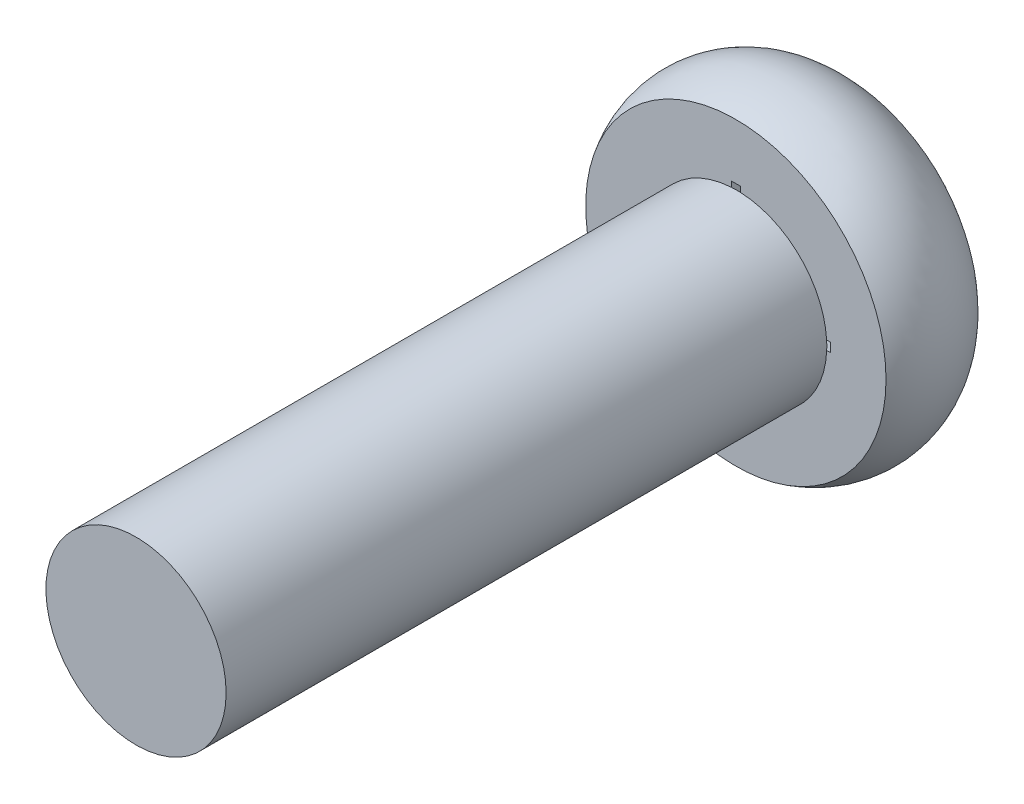
ISO-10303-21;
HEADER;
FILE_DESCRIPTION(('STEP AP214'),'2;1');
FILE_NAME('part.step','',(''),(''),'','','');
FILE_SCHEMA(('AUTOMOTIVE_DESIGN { 1 0 10303 214 1 1 1 1 }'));
ENDSEC;
DATA;
#1=APPLICATION_CONTEXT('core data for automotive mechanical design processes');
#2=APPLICATION_PROTOCOL_DEFINITION('international standard','automotive_design',2000,#1);
#3=PRODUCT_CONTEXT('',#1,'mechanical');
#4=PRODUCT('Part','Part','',(#3));
#5=PRODUCT_RELATED_PRODUCT_CATEGORY('part','',(#4));
#6=PRODUCT_DEFINITION_FORMATION('','',#4);
#7=PRODUCT_DEFINITION_CONTEXT('part definition',#1,'design');
#8=PRODUCT_DEFINITION('design','',#6,#7);
#9=PRODUCT_DEFINITION_SHAPE('','',#8);
#10=(LENGTH_UNIT() NAMED_UNIT(*) SI_UNIT(.MILLI.,.METRE.));
#11=(NAMED_UNIT(*) PLANE_ANGLE_UNIT() SI_UNIT($,.RADIAN.));
#12=(NAMED_UNIT(*) SI_UNIT($,.STERADIAN.) SOLID_ANGLE_UNIT());
#13=UNCERTAINTY_MEASURE_WITH_UNIT(LENGTH_MEASURE(1.E-05),#10,'distance_accuracy_value','');
#14=(GEOMETRIC_REPRESENTATION_CONTEXT(3) GLOBAL_UNCERTAINTY_ASSIGNED_CONTEXT((#13)) GLOBAL_UNIT_ASSIGNED_CONTEXT((#10,
#11,#12)) REPRESENTATION_CONTEXT('',''));
#15=CARTESIAN_POINT('',(0.,0.,0.));
#16=DIRECTION('',(0.,0.,1.));
#17=DIRECTION('',(1.,0.,0.));
#18=AXIS2_PLACEMENT_3D('',#15,#16,#17);
#19=CARTESIAN_POINT('',(0.,0.,-2.));
#20=DIRECTION('',(0.,0.,-1.));
#21=DIRECTION('',(-1.,0.,0.));
#22=AXIS2_PLACEMENT_3D('',#19,#20,#21);
#23=PLANE('',#22);
#24=DIRECTION('',(0.,-1.,0.));
#25=VECTOR('',#24,1.);
#26=CARTESIAN_POINT('',(0.5,-0.5,-2.));
#27=LINE('',#26,#25);
#28=CARTESIAN_POINT('',(0.5,-0.5,-2.));
#29=VERTEX_POINT('',#28);
#30=CARTESIAN_POINT('',(0.5,-1.72737700560521,-2.));
#31=VERTEX_POINT('',#30);
#32=EDGE_CURVE('E297',#29,#31,#27,.T.);
#33=ORIENTED_EDGE('',*,*,#32,.F.);
#34=DIRECTION('',(-1.,0.,0.));
#35=VECTOR('',#34,1.);
#36=CARTESIAN_POINT('',(2.,-0.5,-2.));
#37=LINE('',#36,#35);
#38=CARTESIAN_POINT('',(1.72737700560521,-0.5,-2.));
#39=VERTEX_POINT('',#38);
#40=EDGE_CURVE('E295',#39,#29,#37,.T.);
#41=ORIENTED_EDGE('',*,*,#40,.F.);
#42=CARTESIAN_POINT('',(0.,0.,-2.));
#43=DIRECTION('',(0.,0.,1.));
#44=DIRECTION('',(1.,0.,0.));
#45=AXIS2_PLACEMENT_3D('',#42,#43,#44);
#46=CIRCLE('',#45,1.79828566126008);
#47=EDGE_CURVE('E365',#31,#39,#46,.T.);
#48=ORIENTED_EDGE('',*,*,#47,.F.);
#49=EDGE_LOOP('',(#33,#41,#48));
#50=FACE_BOUND('',#49,.T.);
#51=ADVANCED_FACE('F35',(#50),#23,.T.);
#52=DIRECTION('',(1.,0.,0.));
#53=VECTOR('',#52,1.);
#54=CARTESIAN_POINT('',(2.,0.5,-2.));
#55=LINE('',#54,#53);
#56=CARTESIAN_POINT('',(0.5,0.5,-2.));
#57=VERTEX_POINT('',#56);
#58=CARTESIAN_POINT('',(1.72737700560521,0.5,-2.));
#59=VERTEX_POINT('',#58);
#60=EDGE_CURVE('E288',#57,#59,#55,.T.);
#61=ORIENTED_EDGE('',*,*,#60,.F.);
#62=DIRECTION('',(0.,-1.,0.));
#63=VECTOR('',#62,1.);
#64=CARTESIAN_POINT('',(0.5,2.,-2.));
#65=LINE('',#64,#63);
#66=CARTESIAN_POINT('',(0.5,1.72737700560521,-2.));
#67=VERTEX_POINT('',#66);
#68=EDGE_CURVE('E286',#67,#57,#65,.T.);
#69=ORIENTED_EDGE('',*,*,#68,.F.);
#70=EDGE_CURVE('E366',#59,#67,#46,.T.);
#71=ORIENTED_EDGE('',*,*,#70,.F.);
#72=EDGE_LOOP('',(#61,#69,#71));
#73=FACE_BOUND('',#72,.T.);
#74=ADVANCED_FACE('F259',(#73),#23,.T.);
#75=DIRECTION('',(0.,1.,0.));
#76=VECTOR('',#75,1.);
#77=CARTESIAN_POINT('',(-0.5,2.,-2.));
#78=LINE('',#77,#76);
#79=CARTESIAN_POINT('',(-0.5,0.5,-2.));
#80=VERTEX_POINT('',#79);
#81=CARTESIAN_POINT('',(-0.5,1.72737700560521,-2.));
#82=VERTEX_POINT('',#81);
#83=EDGE_CURVE('E279',#80,#82,#78,.T.);
#84=ORIENTED_EDGE('',*,*,#83,.F.);
#85=DIRECTION('',(1.,0.,0.));
#86=VECTOR('',#85,1.);
#87=CARTESIAN_POINT('',(-0.5,0.5,-2.));
#88=LINE('',#87,#86);
#89=CARTESIAN_POINT('',(-1.7273770056052,0.5,-2.));
#90=VERTEX_POINT('',#89);
#91=EDGE_CURVE('E280',#90,#80,#88,.T.);
#92=ORIENTED_EDGE('',*,*,#91,.F.);
#93=EDGE_CURVE('E282',#82,#90,#46,.T.);
#94=ORIENTED_EDGE('',*,*,#93,.F.);
#95=EDGE_LOOP('',(#84,#92,#94));
#96=FACE_BOUND('',#95,.T.);
#97=ADVANCED_FACE('F264',(#96),#23,.T.);
#98=CARTESIAN_POINT('',(0.,0.,0.));
#99=DIRECTION('',(0.,0.,1.));
#100=DIRECTION('',(1.,0.,0.));
#101=AXIS2_PLACEMENT_3D('',#98,#99,#100);
#102=PLANE('',#101);
#103=CARTESIAN_POINT('',(0.0135896024399493,-0.0135896024399496,0.));
#104=DIRECTION('',(0.,0.,1.));
#105=DIRECTION('',(1.,0.,0.));
#106=AXIS2_PLACEMENT_3D('',#103,#104,#105);
#107=CIRCLE('',#106,1.5);
#108=CARTESIAN_POINT('',(1.51097796644111,0.074886876659955,0.));
#109=VERTEX_POINT('',#108);
#110=CARTESIAN_POINT('',(0.0748868766599548,1.48515742230212,0.));
#111=VERTEX_POINT('',#110);
#112=EDGE_CURVE('E65',#109,#111,#107,.T.);
#113=ORIENTED_EDGE('',*,*,#112,.F.);
#114=DIRECTION('',(1.,0.,0.));
#115=VECTOR('',#114,1.);
#116=CARTESIAN_POINT('',(0.,0.074886876659955,0.));
#117=LINE('',#116,#115);
#118=CARTESIAN_POINT('',(1.57488687665996,0.0748868766599549,0.));
#119=VERTEX_POINT('',#118);
#120=EDGE_CURVE('E185',#109,#119,#117,.T.);
#121=ORIENTED_EDGE('',*,*,#120,.T.);
#122=DIRECTION('',(0.,-1.,0.));
#123=VECTOR('',#122,1.);
#124=CARTESIAN_POINT('',(1.57488687665995,0.,0.));
#125=LINE('',#124,#123);
#126=CARTESIAN_POINT('',(1.57488687665996,-0.074886876659955,0.));
#127=VERTEX_POINT('',#126);
#128=EDGE_CURVE('E344',#119,#127,#125,.T.);
#129=ORIENTED_EDGE('',*,*,#128,.T.);
#130=DIRECTION('',(-1.,0.,0.));
#131=VECTOR('',#130,1.);
#132=CARTESIAN_POINT('',(0.,-0.0748868766599549,0.));
#133=LINE('',#132,#131);
#134=CARTESIAN_POINT('',(1.51233662718202,-0.0748868766599549,0.));
#135=VERTEX_POINT('',#134);
#136=EDGE_CURVE('E341',#127,#135,#133,.T.);
#137=ORIENTED_EDGE('',*,*,#136,.T.);
#138=CARTESIAN_POINT('',(0.0748868766599548,-1.51233662718202,0.));
#139=VERTEX_POINT('',#138);
#140=EDGE_CURVE('E58',#139,#135,#107,.T.);
#141=ORIENTED_EDGE('',*,*,#140,.F.);
#142=DIRECTION('',(0.,-1.,0.));
#143=VECTOR('',#142,1.);
#144=CARTESIAN_POINT('',(0.0748868766599551,0.,0.));
#145=LINE('',#144,#143);
#146=CARTESIAN_POINT('',(0.0748868766599548,-1.57488687665996,0.));
#147=VERTEX_POINT('',#146);
#148=EDGE_CURVE('E340',#139,#147,#145,.T.);
#149=ORIENTED_EDGE('',*,*,#148,.T.);
#150=DIRECTION('',(-1.,0.,0.));
#151=VECTOR('',#150,1.);
#152=CARTESIAN_POINT('',(0.,-1.57488687665995,0.));
#153=LINE('',#152,#151);
#154=CARTESIAN_POINT('',(-0.0748868766599552,-1.57488687665996,0.));
#155=VERTEX_POINT('',#154);
#156=EDGE_CURVE('E308',#147,#155,#153,.T.);
#157=ORIENTED_EDGE('',*,*,#156,.T.);
#158=DIRECTION('',(0.,1.,0.));
#159=VECTOR('',#158,1.);
#160=CARTESIAN_POINT('',(-0.0748868766599548,0.,0.));
#161=LINE('',#160,#159);
#162=CARTESIAN_POINT('',(-0.074886876659955,-1.51097796644111,0.));
#163=VERTEX_POINT('',#162);
#164=EDGE_CURVE('E332',#155,#163,#161,.T.);
#165=ORIENTED_EDGE('',*,*,#164,.T.);
#166=CARTESIAN_POINT('',(-1.48515742230212,-0.0748868766599549,0.));
#167=VERTEX_POINT('',#166);
#168=EDGE_CURVE('E49',#167,#163,#107,.T.);
#169=ORIENTED_EDGE('',*,*,#168,.F.);
#170=DIRECTION('',(-1.,0.,0.));
#171=VECTOR('',#170,1.);
#172=CARTESIAN_POINT('',(0.,-0.0748868766599549,0.));
#173=LINE('',#172,#171);
#174=CARTESIAN_POINT('',(-1.57488687665995,-0.0748868766599549,0.));
#175=VERTEX_POINT('',#174);
#176=EDGE_CURVE('E334',#167,#175,#173,.T.);
#177=ORIENTED_EDGE('',*,*,#176,.T.);
#178=DIRECTION('',(0.,1.,0.));
#179=VECTOR('',#178,1.);
#180=CARTESIAN_POINT('',(-1.57488687665995,0.,0.));
#181=LINE('',#180,#179);
#182=CARTESIAN_POINT('',(-1.57488687665996,0.074886876659955,0.));
#183=VERTEX_POINT('',#182);
#184=EDGE_CURVE('E355',#175,#183,#181,.T.);
#185=ORIENTED_EDGE('',*,*,#184,.T.);
#186=DIRECTION('',(1.,0.,0.));
#187=VECTOR('',#186,1.);
#188=CARTESIAN_POINT('',(0.,0.0748868766599549,0.));
#189=LINE('',#188,#187);
#190=CARTESIAN_POINT('',(-1.48379876156122,0.0748868766599549,0.));
#191=VERTEX_POINT('',#190);
#192=EDGE_CURVE('E352',#183,#191,#189,.T.);
#193=ORIENTED_EDGE('',*,*,#192,.T.);
#194=CARTESIAN_POINT('',(-0.0748868766599547,1.48379876156122,0.));
#195=VERTEX_POINT('',#194);
#196=EDGE_CURVE('E11',#195,#191,#107,.T.);
#197=ORIENTED_EDGE('',*,*,#196,.F.);
#198=DIRECTION('',(0.,1.,0.));
#199=VECTOR('',#198,1.);
#200=CARTESIAN_POINT('',(-0.0748868766599548,0.,0.));
#201=LINE('',#200,#199);
#202=CARTESIAN_POINT('',(-0.0748868766599548,1.57488687665996,0.));
#203=VERTEX_POINT('',#202);
#204=EDGE_CURVE('E351',#195,#203,#201,.T.);
#205=ORIENTED_EDGE('',*,*,#204,.T.);
#206=DIRECTION('',(1.,0.,0.));
#207=VECTOR('',#206,1.);
#208=CARTESIAN_POINT('',(0.,1.57488687665995,0.));
#209=LINE('',#208,#207);
#210=CARTESIAN_POINT('',(0.0748868766599549,1.57488687665996,0.));
#211=VERTEX_POINT('',#210);
#212=EDGE_CURVE('E182',#203,#211,#209,.T.);
#213=ORIENTED_EDGE('',*,*,#212,.T.);
#214=DIRECTION('',(0.,-1.,0.));
#215=VECTOR('',#214,1.);
#216=CARTESIAN_POINT('',(0.0748868766599546,0.,0.));
#217=LINE('',#216,#215);
#218=EDGE_CURVE('E178',#211,#111,#217,.T.);
#219=ORIENTED_EDGE('',*,*,#218,.T.);
#220=EDGE_LOOP('',(#113,#121,#129,#137,#141,#149,#157,#165,#169,#177,#185,#193,#197,#205,#213,#219));
#221=FACE_BOUND('',#220,.T.);
#222=CARTESIAN_POINT('',(0.,0.,0.));
#223=DIRECTION('',(0.,0.,1.));
#224=DIRECTION('',(1.,0.,0.));
#225=AXIS2_PLACEMENT_3D('',#222,#223,#224);
#226=CIRCLE('',#225,2.5);
#227=CARTESIAN_POINT('',(2.5,0.,0.));
#228=VERTEX_POINT('',#227);
#229=EDGE_CURVE('E302',#228,#228,#226,.T.);
#230=ORIENTED_EDGE('',*,*,#229,.T.);
#231=EDGE_LOOP('',(#230));
#232=FACE_BOUND('',#231,.T.);
#233=ADVANCED_FACE('F37',(#221,#232),#102,.T.);
#234=DIRECTION('',(0.,1.,0.));
#235=VECTOR('',#234,1.);
#236=CARTESIAN_POINT('',(-0.5,-0.5,-2.));
#237=LINE('',#236,#235);
#238=CARTESIAN_POINT('',(-0.5,-1.72737700560521,-2.));
#239=VERTEX_POINT('',#238);
#240=CARTESIAN_POINT('',(-0.5,-0.5,-2.));
#241=VERTEX_POINT('',#240);
#242=EDGE_CURVE('E211',#239,#241,#237,.T.);
#243=ORIENTED_EDGE('',*,*,#242,.F.);
#244=CARTESIAN_POINT('',(-1.7273770056052,-0.5,-2.));
#245=VERTEX_POINT('',#244);
#246=EDGE_CURVE('E465',#245,#239,#46,.T.);
#247=ORIENTED_EDGE('',*,*,#246,.F.);
#248=DIRECTION('',(-1.,0.,0.));
#249=VECTOR('',#248,1.);
#250=CARTESIAN_POINT('',(-0.5,-0.5,-2.));
#251=LINE('',#250,#249);
#252=EDGE_CURVE('E290',#241,#245,#251,.T.);
#253=ORIENTED_EDGE('',*,*,#252,.F.);
#254=EDGE_LOOP('',(#243,#247,#253));
#255=FACE_BOUND('',#254,.T.);
#256=ADVANCED_FACE('F254',(#255),#23,.T.);
#257=CARTESIAN_POINT('',(0.,0.,-1.5));
#258=DIRECTION('',(0.,0.,1.));
#259=DIRECTION('',(1.,0.,0.));
#260=AXIS2_PLACEMENT_3D('',#257,#258,#259);
#261=TOROIDAL_SURFACE('',#260,1.79828566126008,0.5);
#262=CARTESIAN_POINT('',(-0.484531485230559,-2.00019999999807,-1.92722635966677));
#263=CARTESIAN_POINT('',(-0.487730741656916,-1.97399509292181,-1.94227767777816));
#264=CARTESIAN_POINT('',(-0.490465318957066,-1.94648320162751,-1.95514285248114));
#265=CARTESIAN_POINT('',(-0.494944021195538,-1.88965509794122,-1.97621348988364));
#266=CARTESIAN_POINT('',(-0.49668820162521,-1.86033898674063,-1.98441921364944));
#267=CARTESIAN_POINT('',(-0.499126116457835,-1.80069115496455,-1.99588870117535));
#268=CARTESIAN_POINT('',(-0.499819222481771,-1.7703588379215,-1.99914950864462));
#269=CARTESIAN_POINT('',(-0.500118732977777,-1.70955778735153,-2.00055859474223));
#270=CARTESIAN_POINT('',(-0.499724916277443,-1.67908902731998,-1.99870583283623));
#271=CARTESIAN_POINT('',(-0.497853789650744,-1.61942291189497,-1.98990287416961));
#272=CARTESIAN_POINT('',(-0.496393740016551,-1.59021306252827,-1.98303388069926));
#273=CARTESIAN_POINT('',(-0.492425751368406,-1.53353662294232,-1.96436596183112));
#274=CARTESIAN_POINT('',(-0.489920279158611,-1.50606610316026,-1.95257864183446));
#275=CARTESIAN_POINT('',(-0.485522319982868,-1.46775366051375,-1.931887870676));
#276=CARTESIAN_POINT('',(-0.48401623101767,-1.45586102614728,-1.92480227918278));
#277=CARTESIAN_POINT('',(-0.482405797596021,-1.44431196382551,-1.91722578561798));
#278=B_SPLINE_CURVE_WITH_KNOTS('',3,(#262,#263,#264,#265,#266,#267,#268,#269,#270,#271,#272,
#273,#274,#275,#276,#277),.UNSPECIFIED.,.F.,.F.,(4,2,2,2,2,2,2,4),(0.,0.0910547846834963,
0.182104467117809,0.273208561671024,0.364331195901967,0.454010535018956,0.54347945069811,
0.58520313275069),.UNSPECIFIED.);
#279=CARTESIAN_POINT('',(-0.486182621994021,-1.98618262199402,-1.93499434739903));
#280=VERTEX_POINT('',#279);
#281=EDGE_CURVE('E39',#280,#239,#278,.T.);
#282=ORIENTED_EDGE('',*,*,#281,.F.);
#283=CARTESIAN_POINT('',(0.5002,-1.98581559026671,-1.93326759888358));
#284=CARTESIAN_POINT('',(0.458674648231671,-1.98692132952452,-1.9384696930891));
#285=CARTESIAN_POINT('',(0.417044034812075,-1.98783464761585,-1.94276651688112));
#286=CARTESIAN_POINT('',(0.333664845511619,-1.9893386810461,-1.94984243784272));
#287=CARTESIAN_POINT('',(0.29191632987224,-1.98992953873244,-1.95262220470428));
#288=CARTESIAN_POINT('',(0.208490270761662,-1.99085028730934,-1.95695398618246));
#289=CARTESIAN_POINT('',(0.166812925350122,-1.99118100417595,-1.9585098867108));
#290=CARTESIAN_POINT('',(0.0834237232848287,-1.99161800350579,-1.96056580691581));
#291=CARTESIAN_POINT('',(0.0417118616424145,-1.99172424407747,-1.96106562950817));
#292=CARTESIAN_POINT('',(-0.041711861642414,-1.99172424407747,-1.96106562950817));
#293=CARTESIAN_POINT('',(-0.0834237232848281,-1.99161800350579,-1.96056580691581));
#294=CARTESIAN_POINT('',(-0.166812925350122,-1.99118100417595,-1.9585098867108));
#295=CARTESIAN_POINT('',(-0.208490270761662,-1.99085028730934,-1.95695398618246));
#296=CARTESIAN_POINT('',(-0.291916329872239,-1.98992953873244,-1.95262220470428));
#297=CARTESIAN_POINT('',(-0.333664845511618,-1.9893386810461,-1.94984243784272));
#298=CARTESIAN_POINT('',(-0.417044034812074,-1.98783464761585,-1.94276651688112));
#299=CARTESIAN_POINT('',(-0.45867464823167,-1.98692132952452,-1.9384696930891));
#300=CARTESIAN_POINT('',(-0.5002,-1.98581559026671,-1.93326759888359));
#301=B_SPLINE_CURVE_WITH_KNOTS('',3,(#283,#284,#285,#286,#287,#288,#289,#290,#291,#292,#293,
#294,#295,#296,#297,#298,#299,#300),.UNSPECIFIED.,.F.,.F.,(4,2,2,2,2,2,2,2,4),(0.,
0.125564223486189,0.251072972778261,0.376181590916074,0.501313554648638,0.626445518381203,
0.751554136519016,0.877062885811087,1.00262710929728),.UNSPECIFIED.);
#302=CARTESIAN_POINT('',(0.486182621995521,-1.98618262199552,-1.93499434740608));
#303=VERTEX_POINT('',#302);
#304=EDGE_CURVE('E217',#303,#280,#301,.T.);
#305=ORIENTED_EDGE('',*,*,#304,.F.);
#306=CARTESIAN_POINT('',(0.482405797596021,-1.44431196382551,-1.91722578561798));
#307=CARTESIAN_POINT('',(0.48570203714361,-1.46793057965583,-1.93273337344162));
#308=CARTESIAN_POINT('',(0.488553243755359,-1.49294141348437,-1.9461472459156));
#309=CARTESIAN_POINT('',(0.493325435218341,-1.54485980961068,-1.96859864156054));
#310=CARTESIAN_POINT('',(0.495248995147375,-1.5717618809991,-1.97764827952006));
#311=CARTESIAN_POINT('',(0.498143025152659,-1.62668784813388,-1.99126362022065));
#312=CARTESIAN_POINT('',(0.499114471003381,-1.65471056465713,-1.99583391361969));
#313=CARTESIAN_POINT('',(0.500106949655182,-1.71116057422037,-2.00050315856797));
#314=CARTESIAN_POINT('',(0.500127192003302,-1.73958818410787,-2.00059839132842));
#315=CARTESIAN_POINT('',(0.499213639216544,-1.79721040961986,-1.99630046338124));
#316=CARTESIAN_POINT('',(0.498242311098956,-1.8263912500544,-1.99173072387306));
#317=CARTESIAN_POINT('',(0.49532622888695,-1.88357006660964,-1.97801163569674));
#318=CARTESIAN_POINT('',(0.493382581774675,-1.91156934871115,-1.96886749497013));
#319=CARTESIAN_POINT('',(0.489106524735073,-1.95978622862111,-1.94875022827176));
#320=CARTESIAN_POINT('',(0.486951064586047,-1.98037020541711,-1.93860958555488));
#321=CARTESIAN_POINT('',(0.484531485230559,-2.00019999999807,-1.92722635966678));
#322=B_SPLINE_CURVE_WITH_KNOTS('',3,(#306,#307,#308,#309,#310,#311,#312,#313,#314,#315,#316,
#317,#318,#319,#320,#321),.UNSPECIFIED.,.F.,.F.,(4,2,2,2,2,2,2,4),(0.,0.0851751988614574,
0.170112576964328,0.254962815655872,0.339883563903854,0.428142412513317,0.516301006602909,
0.585253181874986),.UNSPECIFIED.);
#323=EDGE_CURVE('E222',#31,#303,#322,.T.);
#324=ORIENTED_EDGE('',*,*,#323,.F.);
#325=ORIENTED_EDGE('',*,*,#47,.T.);
#326=CARTESIAN_POINT('',(2.00019999999807,-0.484531485230559,-1.92722635966678));
#327=CARTESIAN_POINT('',(1.97399509292181,-0.487730741656916,-1.94227767777816));
#328=CARTESIAN_POINT('',(1.94648320162751,-0.490465318957066,-1.95514285248114));
#329=CARTESIAN_POINT('',(1.88965509794122,-0.494944021195538,-1.97621348988364));
#330=CARTESIAN_POINT('',(1.86033898674063,-0.49668820162521,-1.98441921364944));
#331=CARTESIAN_POINT('',(1.80069115496455,-0.499126116457835,-1.99588870117535));
#332=CARTESIAN_POINT('',(1.7703588379215,-0.499819222481771,-1.99914950864462));
#333=CARTESIAN_POINT('',(1.70955778735153,-0.500118732977777,-2.00055859474224));
#334=CARTESIAN_POINT('',(1.67908902731998,-0.499724916277443,-1.99870583283623));
#335=CARTESIAN_POINT('',(1.61942291189497,-0.497853789650743,-1.98990287416961));
#336=CARTESIAN_POINT('',(1.59021306252827,-0.49639374001655,-1.98303388069925));
#337=CARTESIAN_POINT('',(1.53353662294232,-0.492425751368405,-1.96436596183112));
#338=CARTESIAN_POINT('',(1.50606610316026,-0.48992027915861,-1.95257864183446));
#339=CARTESIAN_POINT('',(1.46775366051375,-0.485522319982867,-1.931887870676));
#340=CARTESIAN_POINT('',(1.45586102614728,-0.484016231017669,-1.92480227918278));
#341=CARTESIAN_POINT('',(1.44431196382552,-0.482405797596021,-1.91722578561798));
#342=B_SPLINE_CURVE_WITH_KNOTS('',3,(#326,#327,#328,#329,#330,#331,#332,#333,#334,#335,#336,
#337,#338,#339,#340,#341),.UNSPECIFIED.,.F.,.F.,(4,2,2,2,2,2,2,4),(0.,0.0910547846834966,
0.182104467117809,0.273208561671024,0.364331195901968,0.454010535018956,0.543479450698109,
0.585203132750685),.UNSPECIFIED.);
#343=CARTESIAN_POINT('',(1.98618262199402,-0.486182621994021,-1.93499434739903));
#344=VERTEX_POINT('',#343);
#345=EDGE_CURVE('E226',#344,#39,#342,.T.);
#346=ORIENTED_EDGE('',*,*,#345,.F.);
#347=CARTESIAN_POINT('',(1.98581559026671,0.5002,-1.93326759888358));
#348=CARTESIAN_POINT('',(1.98692132952452,0.458674648231671,-1.9384696930891));
#349=CARTESIAN_POINT('',(1.98783464761585,0.417044034812075,-1.94276651688112));
#350=CARTESIAN_POINT('',(1.9893386810461,0.333664845511619,-1.94984243784273));
#351=CARTESIAN_POINT('',(1.98992953873244,0.29191632987224,-1.95262220470428));
#352=CARTESIAN_POINT('',(1.99085028730934,0.208490270761663,-1.95695398618246));
#353=CARTESIAN_POINT('',(1.99118100417595,0.166812925350123,-1.95850988671081));
#354=CARTESIAN_POINT('',(1.99161800350579,0.0834237232848289,-1.96056580691581));
#355=CARTESIAN_POINT('',(1.99172424407747,0.0417118616424147,-1.96106562950817));
#356=CARTESIAN_POINT('',(1.99172424407747,-0.0417118616424138,-1.96106562950817));
#357=CARTESIAN_POINT('',(1.99161800350579,-0.083423723284828,-1.96056580691581));
#358=CARTESIAN_POINT('',(1.99118100417595,-0.166812925350122,-1.95850988671081));
#359=CARTESIAN_POINT('',(1.99085028730934,-0.208490270761661,-1.95695398618246));
#360=CARTESIAN_POINT('',(1.98992953873244,-0.291916329872239,-1.95262220470428));
#361=CARTESIAN_POINT('',(1.9893386810461,-0.333664845511618,-1.94984243784272));
#362=CARTESIAN_POINT('',(1.98783464761585,-0.417044034812074,-1.94276651688112));
#363=CARTESIAN_POINT('',(1.98692132952452,-0.45867464823167,-1.93846969308911));
#364=CARTESIAN_POINT('',(1.98581559026671,-0.500199999999999,-1.93326759888359));
#365=B_SPLINE_CURVE_WITH_KNOTS('',3,(#347,#348,#349,#350,#351,#352,#353,#354,#355,#356,#357,
#358,#359,#360,#361,#362,#363,#364),.UNSPECIFIED.,.F.,.F.,(4,2,2,2,2,2,2,2,4),(0.,
0.125564223486189,0.251072972778261,0.376181590916074,0.501313554648638,0.626445518381203,
0.751554136519016,0.877062885811087,1.00262710929728),.UNSPECIFIED.);
#366=CARTESIAN_POINT('',(1.98618262199552,0.486182621995521,-1.93499434740608));
#367=VERTEX_POINT('',#366);
#368=EDGE_CURVE('E440',#367,#344,#365,.T.);
#369=ORIENTED_EDGE('',*,*,#368,.F.);
#370=CARTESIAN_POINT('',(1.44431196382552,0.482405797596021,-1.91722578561798));
#371=CARTESIAN_POINT('',(1.46793057965583,0.48570203714361,-1.93273337344162));
#372=CARTESIAN_POINT('',(1.49294141348437,0.488553243755359,-1.9461472459156));
#373=CARTESIAN_POINT('',(1.54485980961068,0.493325435218341,-1.96859864156054));
#374=CARTESIAN_POINT('',(1.5717618809991,0.495248995147375,-1.97764827952006));
#375=CARTESIAN_POINT('',(1.62668784813388,0.498143025152659,-1.99126362022065));
#376=CARTESIAN_POINT('',(1.65471056465713,0.499114471003381,-1.99583391361969));
#377=CARTESIAN_POINT('',(1.71116057422037,0.500106949655182,-2.00050315856797));
#378=CARTESIAN_POINT('',(1.73958818410787,0.500127192003302,-2.00059839132842));
#379=CARTESIAN_POINT('',(1.79721040961986,0.499213639216544,-1.99630046338124));
#380=CARTESIAN_POINT('',(1.8263912500544,0.498242311098957,-1.99173072387306));
#381=CARTESIAN_POINT('',(1.88357006660964,0.495326228886951,-1.97801163569674));
#382=CARTESIAN_POINT('',(1.91156934871115,0.493382581774675,-1.96886749497012));
#383=CARTESIAN_POINT('',(1.95978622862112,0.489106524735073,-1.94875022827176));
#384=CARTESIAN_POINT('',(1.98037020541711,0.486951064586048,-1.93860958555488));
#385=CARTESIAN_POINT('',(2.00019999999807,0.484531485230559,-1.92722635966678));
#386=B_SPLINE_CURVE_WITH_KNOTS('',3,(#370,#371,#372,#373,#374,#375,#376,#377,#378,#379,#380,
#381,#382,#383,#384,#385),.UNSPECIFIED.,.F.,.F.,(4,2,2,2,2,2,2,4),(0.,0.0851751988614576,
0.170112576964329,0.254962815655873,0.339883563903855,0.428142412513318,0.516301006602911,
0.585253181874984),.UNSPECIFIED.);
#387=EDGE_CURVE('E435',#59,#367,#386,.T.);
#388=ORIENTED_EDGE('',*,*,#387,.F.);
#389=ORIENTED_EDGE('',*,*,#70,.T.);
#390=CARTESIAN_POINT('',(0.484531485230559,2.00019999999807,-1.92722635966678));
#391=CARTESIAN_POINT('',(0.487730741656916,1.97399509292181,-1.94227767777816));
#392=CARTESIAN_POINT('',(0.490465318957066,1.94648320162751,-1.95514285248114));
#393=CARTESIAN_POINT('',(0.494944021195538,1.88965509794122,-1.97621348988364));
#394=CARTESIAN_POINT('',(0.49668820162521,1.86033898674063,-1.98441921364944));
#395=CARTESIAN_POINT('',(0.499126116457835,1.80069115496455,-1.99588870117535));
#396=CARTESIAN_POINT('',(0.499819222481771,1.7703588379215,-1.99914950864462));
#397=CARTESIAN_POINT('',(0.500118732977777,1.70955778735153,-2.00055859474224));
#398=CARTESIAN_POINT('',(0.499724916277443,1.67908902731998,-1.99870583283623));
#399=CARTESIAN_POINT('',(0.497853789650743,1.61942291189497,-1.98990287416961));
#400=CARTESIAN_POINT('',(0.49639374001655,1.59021306252827,-1.98303388069925));
#401=CARTESIAN_POINT('',(0.492425751368405,1.53353662294232,-1.96436596183112));
#402=CARTESIAN_POINT('',(0.48992027915861,1.50606610316026,-1.95257864183446));
#403=CARTESIAN_POINT('',(0.485522319982867,1.46775366051375,-1.931887870676));
#404=CARTESIAN_POINT('',(0.484016231017669,1.45586102614728,-1.92480227918278));
#405=CARTESIAN_POINT('',(0.482405797596021,1.44431196382551,-1.91722578561798));
#406=B_SPLINE_CURVE_WITH_KNOTS('',3,(#390,#391,#392,#393,#394,#395,#396,#397,#398,#399,#400,
#401,#402,#403,#404,#405),.UNSPECIFIED.,.F.,.F.,(4,2,2,2,2,2,2,4),(0.,0.0910547846834967,
0.18210446711781,0.273208561671024,0.364331195901968,0.454010535018957,0.54347945069811,
0.585203132750688),.UNSPECIFIED.);
#407=CARTESIAN_POINT('',(0.486182621994021,1.98618262199402,-1.93499434739903));
#408=VERTEX_POINT('',#407);
#409=EDGE_CURVE('E415',#408,#67,#406,.T.);
#410=ORIENTED_EDGE('',*,*,#409,.F.);
#411=CARTESIAN_POINT('',(-0.5002,1.98581559026671,-1.93326759888358));
#412=CARTESIAN_POINT('',(-0.458674648231671,1.98692132952452,-1.9384696930891));
#413=CARTESIAN_POINT('',(-0.417044034812075,1.98783464761585,-1.94276651688112));
#414=CARTESIAN_POINT('',(-0.333664845511619,1.9893386810461,-1.94984243784272));
#415=CARTESIAN_POINT('',(-0.29191632987224,1.98992953873244,-1.95262220470428));
#416=CARTESIAN_POINT('',(-0.208490270761662,1.99085028730934,-1.95695398618246));
#417=CARTESIAN_POINT('',(-0.166812925350122,1.99118100417595,-1.9585098867108));
#418=CARTESIAN_POINT('',(-0.0834237232848289,1.99161800350579,-1.96056580691581));
#419=CARTESIAN_POINT('',(-0.0417118616424146,1.99172424407747,-1.96106562950817));
#420=CARTESIAN_POINT('',(0.0417118616424138,1.99172424407747,-1.96106562950817));
#421=CARTESIAN_POINT('',(0.0834237232848279,1.99161800350579,-1.96056580691581));
#422=CARTESIAN_POINT('',(0.166812925350122,1.99118100417595,-1.9585098867108));
#423=CARTESIAN_POINT('',(0.208490270761661,1.99085028730934,-1.95695398618246));
#424=CARTESIAN_POINT('',(0.291916329872239,1.98992953873244,-1.95262220470428));
#425=CARTESIAN_POINT('',(0.333664845511618,1.9893386810461,-1.94984243784272));
#426=CARTESIAN_POINT('',(0.417044034812074,1.98783464761585,-1.94276651688112));
#427=CARTESIAN_POINT('',(0.45867464823167,1.98692132952452,-1.93846969308911));
#428=CARTESIAN_POINT('',(0.500199999999999,1.98581559026671,-1.93326759888359));
#429=B_SPLINE_CURVE_WITH_KNOTS('',3,(#411,#412,#413,#414,#415,#416,#417,#418,#419,#420,#421,
#422,#423,#424,#425,#426,#427,#428),.UNSPECIFIED.,.F.,.F.,(4,2,2,2,2,2,2,2,4),(0.,
0.125564223486189,0.251072972778261,0.376181590916074,0.501313554648638,0.626445518381203,
0.751554136519016,0.877062885811087,1.00262710929728),.UNSPECIFIED.);
#430=CARTESIAN_POINT('',(-0.486182621995521,1.98618262199552,-1.93499434740608));
#431=VERTEX_POINT('',#430);
#432=EDGE_CURVE('E410',#431,#408,#429,.T.);
#433=ORIENTED_EDGE('',*,*,#432,.F.);
#434=CARTESIAN_POINT('',(-0.482405797596021,1.44431196382551,-1.91722578561798));
#435=CARTESIAN_POINT('',(-0.485702037143609,1.46793057965583,-1.93273337344162));
#436=CARTESIAN_POINT('',(-0.488553243755359,1.49294141348437,-1.9461472459156));
#437=CARTESIAN_POINT('',(-0.493325435218341,1.54485980961068,-1.96859864156054));
#438=CARTESIAN_POINT('',(-0.495248995147375,1.5717618809991,-1.97764827952006));
#439=CARTESIAN_POINT('',(-0.498143025152659,1.62668784813388,-1.99126362022065));
#440=CARTESIAN_POINT('',(-0.499114471003381,1.65471056465713,-1.99583391361969));
#441=CARTESIAN_POINT('',(-0.500106949655181,1.71116057422037,-2.00050315856797));
#442=CARTESIAN_POINT('',(-0.500127192003302,1.73958818410786,-2.00059839132842));
#443=CARTESIAN_POINT('',(-0.499213639216544,1.79721040961986,-1.99630046338124));
#444=CARTESIAN_POINT('',(-0.498242311098956,1.8263912500544,-1.99173072387306));
#445=CARTESIAN_POINT('',(-0.49532622888695,1.88357006660964,-1.97801163569674));
#446=CARTESIAN_POINT('',(-0.493382581774675,1.91156934871115,-1.96886749497012));
#447=CARTESIAN_POINT('',(-0.489106524735072,1.95978622862111,-1.94875022827176));
#448=CARTESIAN_POINT('',(-0.486951064586047,1.98037020541711,-1.93860958555488));
#449=CARTESIAN_POINT('',(-0.484531485230559,2.00019999999807,-1.92722635966677));
#450=B_SPLINE_CURVE_WITH_KNOTS('',3,(#434,#435,#436,#437,#438,#439,#440,#441,#442,#443,#444,
#445,#446,#447,#448,#449),.UNSPECIFIED.,.F.,.F.,(4,2,2,2,2,2,2,4),(0.,0.0851751988614578,
0.170112576964329,0.254962815655873,0.339883563903855,0.428142412513318,0.51630100660291,
0.585253181874989),.UNSPECIFIED.);
#451=EDGE_CURVE('E405',#82,#431,#450,.T.);
#452=ORIENTED_EDGE('',*,*,#451,.F.);
#453=ORIENTED_EDGE('',*,*,#93,.T.);
#454=CARTESIAN_POINT('',(-2.00019999999807,0.484531485230558,-1.92722635966677));
#455=CARTESIAN_POINT('',(-1.97399509292181,0.487730741656916,-1.94227767777816));
#456=CARTESIAN_POINT('',(-1.94648320162751,0.490465318957066,-1.95514285248114));
#457=CARTESIAN_POINT('',(-1.88965509794122,0.494944021195537,-1.97621348988364));
#458=CARTESIAN_POINT('',(-1.86033898674063,0.49668820162521,-1.98441921364944));
#459=CARTESIAN_POINT('',(-1.80069115496455,0.499126116457835,-1.99588870117535));
#460=CARTESIAN_POINT('',(-1.7703588379215,0.499819222481771,-1.99914950864462));
#461=CARTESIAN_POINT('',(-1.70955778735153,0.500118732977777,-2.00055859474223));
#462=CARTESIAN_POINT('',(-1.67908902731998,0.499724916277443,-1.99870583283623));
#463=CARTESIAN_POINT('',(-1.61942291189497,0.497853789650744,-1.98990287416961));
#464=CARTESIAN_POINT('',(-1.59021306252827,0.49639374001655,-1.98303388069926));
#465=CARTESIAN_POINT('',(-1.53353662294232,0.492425751368405,-1.96436596183112));
#466=CARTESIAN_POINT('',(-1.50606610316026,0.489920279158611,-1.95257864183446));
#467=CARTESIAN_POINT('',(-1.46775366051375,0.485522319982867,-1.931887870676));
#468=CARTESIAN_POINT('',(-1.45586102614727,0.484016231017669,-1.92480227918278));
#469=CARTESIAN_POINT('',(-1.44431196382551,0.482405797596021,-1.91722578561798));
#470=B_SPLINE_CURVE_WITH_KNOTS('',3,(#454,#455,#456,#457,#458,#459,#460,#461,#462,#463,#464,
#465,#466,#467,#468,#469),.UNSPECIFIED.,.F.,.F.,(4,2,2,2,2,2,2,4),(0.,0.0910547846834969,
0.18210446711781,0.273208561671025,0.364331195901969,0.454010535018958,0.543479450698111,
0.585203132750693),.UNSPECIFIED.);
#471=CARTESIAN_POINT('',(-1.98618262199402,0.486182621994021,-1.93499434739903));
#472=VERTEX_POINT('',#471);
#473=EDGE_CURVE('E400',#472,#90,#470,.T.);
#474=ORIENTED_EDGE('',*,*,#473,.F.);
#475=CARTESIAN_POINT('',(-1.98581559026671,-0.5002,-1.93326759888358));
#476=CARTESIAN_POINT('',(-1.98692132952452,-0.458674648231671,-1.9384696930891));
#477=CARTESIAN_POINT('',(-1.98783464761585,-0.417044034812075,-1.94276651688112));
#478=CARTESIAN_POINT('',(-1.9893386810461,-0.333664845511619,-1.94984243784272));
#479=CARTESIAN_POINT('',(-1.98992953873244,-0.29191632987224,-1.95262220470428));
#480=CARTESIAN_POINT('',(-1.99085028730934,-0.208490270761662,-1.95695398618246));
#481=CARTESIAN_POINT('',(-1.99118100417595,-0.166812925350123,-1.9585098867108));
#482=CARTESIAN_POINT('',(-1.99161800350579,-0.0834237232848289,-1.96056580691581));
#483=CARTESIAN_POINT('',(-1.99172424407747,-0.0417118616424146,-1.96106562950817));
#484=CARTESIAN_POINT('',(-1.99172424407747,0.0417118616424138,-1.96106562950817));
#485=CARTESIAN_POINT('',(-1.99161800350579,0.083423723284828,-1.96056580691581));
#486=CARTESIAN_POINT('',(-1.99118100417595,0.166812925350122,-1.9585098867108));
#487=CARTESIAN_POINT('',(-1.99085028730934,0.208490270761661,-1.95695398618246));
#488=CARTESIAN_POINT('',(-1.98992953873244,0.291916329872239,-1.95262220470428));
#489=CARTESIAN_POINT('',(-1.9893386810461,0.333664845511618,-1.94984243784272));
#490=CARTESIAN_POINT('',(-1.98783464761585,0.417044034812074,-1.94276651688112));
#491=CARTESIAN_POINT('',(-1.98692132952452,0.45867464823167,-1.9384696930891));
#492=CARTESIAN_POINT('',(-1.98581559026671,0.500199999999999,-1.93326759888359));
#493=B_SPLINE_CURVE_WITH_KNOTS('',3,(#475,#476,#477,#478,#479,#480,#481,#482,#483,#484,#485,
#486,#487,#488,#489,#490,#491,#492),.UNSPECIFIED.,.F.,.F.,(4,2,2,2,2,2,2,2,4),(0.,
0.125564223486189,0.251072972778261,0.376181590916074,0.501313554648638,0.626445518381203,
0.751554136519016,0.877062885811088,1.00262710929728),.UNSPECIFIED.);
#494=CARTESIAN_POINT('',(-1.98618262199552,-0.486182621995521,-1.93499434740608));
#495=VERTEX_POINT('',#494);
#496=EDGE_CURVE('E375',#495,#472,#493,.T.);
#497=ORIENTED_EDGE('',*,*,#496,.F.);
#498=CARTESIAN_POINT('',(-1.44431196382551,-0.482405797596021,-1.91722578561798));
#499=CARTESIAN_POINT('',(-1.46793057965582,-0.48570203714361,-1.93273337344162));
#500=CARTESIAN_POINT('',(-1.49294141348436,-0.488553243755359,-1.9461472459156));
#501=CARTESIAN_POINT('',(-1.54485980961068,-0.493325435218341,-1.96859864156054));
#502=CARTESIAN_POINT('',(-1.5717618809991,-0.495248995147375,-1.97764827952006));
#503=CARTESIAN_POINT('',(-1.62668784813388,-0.498143025152659,-1.99126362022065));
#504=CARTESIAN_POINT('',(-1.65471056465712,-0.499114471003381,-1.99583391361969));
#505=CARTESIAN_POINT('',(-1.71116057422036,-0.500106949655182,-2.00050315856797));
#506=CARTESIAN_POINT('',(-1.73958818410786,-0.500127192003302,-2.00059839132842));
#507=CARTESIAN_POINT('',(-1.79721040961986,-0.499213639216544,-1.99630046338124));
#508=CARTESIAN_POINT('',(-1.8263912500544,-0.498242311098957,-1.99173072387306));
#509=CARTESIAN_POINT('',(-1.88357006660964,-0.495326228886951,-1.97801163569674));
#510=CARTESIAN_POINT('',(-1.91156934871115,-0.493382581774675,-1.96886749497012));
#511=CARTESIAN_POINT('',(-1.95978622862111,-0.489106524735072,-1.94875022827176));
#512=CARTESIAN_POINT('',(-1.9803702054171,-0.486951064586047,-1.93860958555488));
#513=CARTESIAN_POINT('',(-2.00019999999807,-0.484531485230558,-1.92722635966677));
#514=B_SPLINE_CURVE_WITH_KNOTS('',3,(#498,#499,#500,#501,#502,#503,#504,#505,#506,#507,#508,
#509,#510,#511,#512,#513),.UNSPECIFIED.,.F.,.F.,(4,2,2,2,2,2,2,4),(0.,0.0851751988614576,
0.170112576964329,0.254962815655873,0.339883563903855,0.428142412513318,0.516301006602911,
0.585253181874991),.UNSPECIFIED.);
#515=EDGE_CURVE('E369',#245,#495,#514,.T.);
#516=ORIENTED_EDGE('',*,*,#515,.F.);
#517=ORIENTED_EDGE('',*,*,#246,.T.);
#518=EDGE_LOOP('',(#282,#305,#324,#325,#346,#369,#388,#389,#410,#433,#452,#453,#474,#497,#516,#517));
#519=FACE_BOUND('',#518,.T.);
#520=CARTESIAN_POINT('',(0.,0.,-1.91742578561798));
#521=DIRECTION('',(0.,0.,1.));
#522=DIRECTION('',(1.,0.,0.));
#523=AXIS2_PLACEMENT_3D('',#520,#521,#522);
#524=CIRCLE('',#523,2.0735232195642);
#525=CARTESIAN_POINT('',(2.0735232195642,0.,-1.91742578561798));
#526=VERTEX_POINT('',#525);
#527=EDGE_CURVE('E363',#526,#526,#524,.T.);
#528=ORIENTED_EDGE('',*,*,#527,.F.);
#529=EDGE_LOOP('',(#528));
#530=FACE_BOUND('',#529,.T.);
#531=ADVANCED_FACE('F237',(#519,#530),#261,.T.);
#532=CARTESIAN_POINT('',(0.,0.,-0.738365689933416));
#533=DIRECTION('',(0.,0.,1.));
#534=DIRECTION('',(1.,0.,0.));
#535=AXIS2_PLACEMENT_3D('',#532,#533,#534);
#536=DEGENERATE_TOROIDAL_SURFACE('',#535,1.29608772561263,1.41229906765225,.T.);
#537=ORIENTED_EDGE('',*,*,#527,.T.);
#538=EDGE_LOOP('',(#537));
#539=FACE_BOUND('',#538,.T.);
#540=ORIENTED_EDGE('',*,*,#229,.F.);
#541=EDGE_LOOP('',(#540));
#542=FACE_BOUND('',#541,.T.);
#543=ADVANCED_FACE('F247',(#539,#542),#536,.T.);
#544=CARTESIAN_POINT('',(-0.5,-0.5,-2.));
#545=DIRECTION('',(-0.978147600733806,0.,0.20791169081776));
#546=DIRECTION('',(0.20791169081776,0.,0.978147600733806));
#547=AXIS2_PLACEMENT_3D('',#544,#545,#546);
#548=PLANE('',#547);
#549=ORIENTED_EDGE('',*,*,#281,.T.);
#550=ORIENTED_EDGE('',*,*,#242,.T.);
#551=DIRECTION('',(-0.203558594952779,-0.203558594952779,-0.957667894857973));
#552=VECTOR('',#551,1.);
#553=CARTESIAN_POINT('',(-0.5,-0.5,-2.));
#554=LINE('',#553,#552);
#555=CARTESIAN_POINT('',(-0.0748868766599549,-0.074886876659955,0.));
#556=VERTEX_POINT('',#555);
#557=EDGE_CURVE('E304',#556,#241,#554,.T.);
#558=ORIENTED_EDGE('',*,*,#557,.F.);
#559=EDGE_CURVE('E299',#163,#556,#161,.T.);
#560=ORIENTED_EDGE('',*,*,#559,.F.);
#561=ORIENTED_EDGE('',*,*,#164,.F.);
#562=DIRECTION('',(-0.203558594952779,-0.203558594952779,-0.957667894857973));
#563=VECTOR('',#562,1.);
#564=CARTESIAN_POINT('',(-0.45856389842085,-1.95856389842085,-1.80505846889133));
#565=LINE('',#564,#563);
#566=EDGE_CURVE('E300',#155,#280,#565,.T.);
#567=ORIENTED_EDGE('',*,*,#566,.T.);
#568=EDGE_LOOP('',(#549,#550,#558,#560,#561,#567));
#569=FACE_BOUND('',#568,.T.);
#570=ADVANCED_FACE('F244',(#569),#548,.F.);
#571=CARTESIAN_POINT('',(0.5,-2.,-2.));
#572=DIRECTION('',(0.,-0.978147600733806,0.20791169081776));
#573=DIRECTION('',(0.,-0.20791169081776,-0.978147600733806));
#574=AXIS2_PLACEMENT_3D('',#571,#572,#573);
#575=PLANE('',#574);
#576=ORIENTED_EDGE('',*,*,#304,.T.);
#577=ORIENTED_EDGE('',*,*,#566,.F.);
#578=ORIENTED_EDGE('',*,*,#156,.F.);
#579=DIRECTION('',(0.203558594952779,-0.203558594952779,-0.957667894857973));
#580=VECTOR('',#579,1.);
#581=CARTESIAN_POINT('',(0.437845847631275,-1.93784584763128,-1.70758770333699));
#582=LINE('',#581,#580);
#583=EDGE_CURVE('E303',#147,#303,#582,.T.);
#584=ORIENTED_EDGE('',*,*,#583,.T.);
#585=EDGE_LOOP('',(#576,#577,#578,#584));
#586=FACE_BOUND('',#585,.T.);
#587=ADVANCED_FACE('F240',(#586),#575,.F.);
#588=CARTESIAN_POINT('',(0.5,-0.5,-2.));
#589=DIRECTION('',(0.978147600733806,0.,0.20791169081776));
#590=DIRECTION('',(0.20791169081776,0.,-0.978147600733806));
#591=AXIS2_PLACEMENT_3D('',#588,#589,#590);
#592=PLANE('',#591);
#593=ORIENTED_EDGE('',*,*,#323,.T.);
#594=ORIENTED_EDGE('',*,*,#583,.F.);
#595=ORIENTED_EDGE('',*,*,#148,.F.);
#596=CARTESIAN_POINT('',(0.0748868766599551,-0.074886876659955,0.));
#597=VERTEX_POINT('',#596);
#598=EDGE_CURVE('E337',#597,#139,#145,.T.);
#599=ORIENTED_EDGE('',*,*,#598,.F.);
#600=DIRECTION('',(0.203558594952779,-0.203558594952779,-0.957667894857973));
#601=VECTOR('',#600,1.);
#602=CARTESIAN_POINT('',(0.5,-0.5,-2.));
#603=LINE('',#602,#601);
#604=EDGE_CURVE('E328',#597,#29,#603,.T.);
#605=ORIENTED_EDGE('',*,*,#604,.T.);
#606=ORIENTED_EDGE('',*,*,#32,.T.);
#607=EDGE_LOOP('',(#593,#594,#595,#599,#605,#606));
#608=FACE_BOUND('',#607,.T.);
#609=ADVANCED_FACE('F243',(#608),#592,.F.);
#610=CARTESIAN_POINT('',(2.,-0.5,-2.));
#611=DIRECTION('',(0.,-0.978147600733806,0.20791169081776));
#612=DIRECTION('',(0.,-0.20791169081776,-0.978147600733806));
#613=AXIS2_PLACEMENT_3D('',#610,#611,#612);
#614=PLANE('',#613);
#615=ORIENTED_EDGE('',*,*,#345,.T.);
#616=ORIENTED_EDGE('',*,*,#40,.T.);
#617=ORIENTED_EDGE('',*,*,#604,.F.);
#618=EDGE_CURVE('E343',#135,#597,#133,.T.);
#619=ORIENTED_EDGE('',*,*,#618,.F.);
#620=ORIENTED_EDGE('',*,*,#136,.F.);
#621=DIRECTION('',(0.203558594952779,-0.203558594952779,-0.957667894857973));
#622=VECTOR('',#621,1.);
#623=CARTESIAN_POINT('',(1.95856389842085,-0.45856389842085,-1.80505846889133));
#624=LINE('',#623,#622);
#625=EDGE_CURVE('E325',#127,#344,#624,.T.);
#626=ORIENTED_EDGE('',*,*,#625,.T.);
#627=EDGE_LOOP('',(#615,#616,#617,#619,#620,#626));
#628=FACE_BOUND('',#627,.T.);
#629=ADVANCED_FACE('F447',(#628),#614,.F.);
#630=CARTESIAN_POINT('',(2.,0.5,-2.));
#631=DIRECTION('',(0.978147600733806,0.,0.20791169081776));
#632=DIRECTION('',(0.20791169081776,0.,-0.978147600733806));
#633=AXIS2_PLACEMENT_3D('',#630,#631,#632);
#634=PLANE('',#633);
#635=ORIENTED_EDGE('',*,*,#368,.T.);
#636=ORIENTED_EDGE('',*,*,#625,.F.);
#637=ORIENTED_EDGE('',*,*,#128,.F.);
#638=DIRECTION('',(0.203558594952779,0.203558594952779,-0.957667894857973));
#639=VECTOR('',#638,1.);
#640=CARTESIAN_POINT('',(2.,0.5,-2.));
#641=LINE('',#640,#639);
#642=EDGE_CURVE('E322',#119,#367,#641,.T.);
#643=ORIENTED_EDGE('',*,*,#642,.T.);
#644=EDGE_LOOP('',(#635,#636,#637,#643));
#645=FACE_BOUND('',#644,.T.);
#646=ADVANCED_FACE('F432',(#645),#634,.F.);
#647=CARTESIAN_POINT('',(2.,0.5,-2.));
#648=DIRECTION('',(0.,0.978147600733805,0.20791169081776));
#649=DIRECTION('',(0.,-0.20791169081776,0.978147600733806));
#650=AXIS2_PLACEMENT_3D('',#647,#648,#649);
#651=PLANE('',#650);
#652=ORIENTED_EDGE('',*,*,#387,.T.);
#653=ORIENTED_EDGE('',*,*,#642,.F.);
#654=ORIENTED_EDGE('',*,*,#120,.F.);
#655=CARTESIAN_POINT('',(0.0748868766599547,0.0748868766599549,0.));
#656=VERTEX_POINT('',#655);
#657=EDGE_CURVE('E347',#656,#109,#117,.T.);
#658=ORIENTED_EDGE('',*,*,#657,.F.);
#659=DIRECTION('',(0.203558594952779,0.203558594952779,-0.957667894857973));
#660=VECTOR('',#659,1.);
#661=CARTESIAN_POINT('',(0.562154152368724,0.562154152368725,-2.29241229666301));
#662=LINE('',#661,#660);
#663=EDGE_CURVE('E192',#656,#57,#662,.T.);
#664=ORIENTED_EDGE('',*,*,#663,.T.);
#665=ORIENTED_EDGE('',*,*,#60,.T.);
#666=EDGE_LOOP('',(#652,#653,#654,#658,#664,#665));
#667=FACE_BOUND('',#666,.T.);
#668=ADVANCED_FACE('F428',(#667),#651,.F.);
#669=CARTESIAN_POINT('',(0.5,2.,-2.));
#670=DIRECTION('',(0.978147600733806,0.,0.20791169081776));
#671=DIRECTION('',(0.20791169081776,0.,-0.978147600733806));
#672=AXIS2_PLACEMENT_3D('',#669,#670,#671);
#673=PLANE('',#672);
#674=ORIENTED_EDGE('',*,*,#409,.T.);
#675=ORIENTED_EDGE('',*,*,#68,.T.);
#676=ORIENTED_EDGE('',*,*,#663,.F.);
#677=EDGE_CURVE('E186',#111,#656,#217,.T.);
#678=ORIENTED_EDGE('',*,*,#677,.F.);
#679=ORIENTED_EDGE('',*,*,#218,.F.);
#680=DIRECTION('',(0.203558594952779,0.203558594952779,-0.957667894857973));
#681=VECTOR('',#680,1.);
#682=CARTESIAN_POINT('',(0.5,2.,-2.));
#683=LINE('',#682,#681);
#684=EDGE_CURVE('E319',#211,#408,#683,.T.);
#685=ORIENTED_EDGE('',*,*,#684,.T.);
#686=EDGE_LOOP('',(#674,#675,#676,#678,#679,#685));
#687=FACE_BOUND('',#686,.T.);
#688=ADVANCED_FACE('F190',(#687),#673,.F.);
#689=CARTESIAN_POINT('',(0.5,2.,-2.));
#690=DIRECTION('',(0.,0.978147600733806,0.20791169081776));
#691=DIRECTION('',(0.,-0.20791169081776,0.978147600733806));
#692=AXIS2_PLACEMENT_3D('',#689,#690,#691);
#693=PLANE('',#692);
#694=ORIENTED_EDGE('',*,*,#432,.T.);
#695=ORIENTED_EDGE('',*,*,#684,.F.);
#696=ORIENTED_EDGE('',*,*,#212,.F.);
#697=DIRECTION('',(-0.203558594952779,0.203558594952779,-0.957667894857973));
#698=VECTOR('',#697,1.);
#699=CARTESIAN_POINT('',(-0.5,2.,-2.));
#700=LINE('',#699,#698);
#701=EDGE_CURVE('E316',#203,#431,#700,.T.);
#702=ORIENTED_EDGE('',*,*,#701,.T.);
#703=EDGE_LOOP('',(#694,#695,#696,#702));
#704=FACE_BOUND('',#703,.T.);
#705=ADVANCED_FACE('F421',(#704),#693,.F.);
#706=CARTESIAN_POINT('',(-0.5,2.,-2.));
#707=DIRECTION('',(-0.978147600733806,0.,0.20791169081776));
#708=DIRECTION('',(0.20791169081776,0.,0.978147600733806));
#709=AXIS2_PLACEMENT_3D('',#706,#707,#708);
#710=PLANE('',#709);
#711=ORIENTED_EDGE('',*,*,#451,.T.);
#712=ORIENTED_EDGE('',*,*,#701,.F.);
#713=ORIENTED_EDGE('',*,*,#204,.F.);
#714=CARTESIAN_POINT('',(-0.0748868766599549,0.074886876659955,0.));
#715=VERTEX_POINT('',#714);
#716=EDGE_CURVE('E202',#715,#195,#201,.T.);
#717=ORIENTED_EDGE('',*,*,#716,.F.);
#718=DIRECTION('',(-0.203558594952779,0.203558594952779,-0.957667894857973));
#719=VECTOR('',#718,1.);
#720=CARTESIAN_POINT('',(-0.562154152368724,0.562154152368725,-2.29241229666301));
#721=LINE('',#720,#719);
#722=EDGE_CURVE('E314',#715,#80,#721,.T.);
#723=ORIENTED_EDGE('',*,*,#722,.T.);
#724=ORIENTED_EDGE('',*,*,#83,.T.);
#725=EDGE_LOOP('',(#711,#712,#713,#717,#723,#724));
#726=FACE_BOUND('',#725,.T.);
#727=ADVANCED_FACE('F396',(#726),#710,.F.);
#728=CARTESIAN_POINT('',(-0.5,0.5,-2.));
#729=DIRECTION('',(0.,0.978147600733806,0.20791169081776));
#730=DIRECTION('',(0.,-0.20791169081776,0.978147600733806));
#731=AXIS2_PLACEMENT_3D('',#728,#729,#730);
#732=PLANE('',#731);
#733=ORIENTED_EDGE('',*,*,#473,.T.);
#734=ORIENTED_EDGE('',*,*,#91,.T.);
#735=ORIENTED_EDGE('',*,*,#722,.F.);
#736=EDGE_CURVE('E354',#191,#715,#189,.T.);
#737=ORIENTED_EDGE('',*,*,#736,.F.);
#738=ORIENTED_EDGE('',*,*,#192,.F.);
#739=DIRECTION('',(-0.203558594952779,0.203558594952779,-0.957667894857973));
#740=VECTOR('',#739,1.);
#741=CARTESIAN_POINT('',(-2.,0.5,-2.));
#742=LINE('',#741,#740);
#743=EDGE_CURVE('E311',#183,#472,#742,.T.);
#744=ORIENTED_EDGE('',*,*,#743,.T.);
#745=EDGE_LOOP('',(#733,#734,#735,#737,#738,#744));
#746=FACE_BOUND('',#745,.T.);
#747=ADVANCED_FACE('F391',(#746),#732,.F.);
#748=CARTESIAN_POINT('',(-2.,0.5,-2.));
#749=DIRECTION('',(-0.978147600733806,0.,0.20791169081776));
#750=DIRECTION('',(0.20791169081776,0.,0.978147600733806));
#751=AXIS2_PLACEMENT_3D('',#748,#749,#750);
#752=PLANE('',#751);
#753=ORIENTED_EDGE('',*,*,#496,.T.);
#754=ORIENTED_EDGE('',*,*,#743,.F.);
#755=ORIENTED_EDGE('',*,*,#184,.F.);
#756=DIRECTION('',(-0.203558594952779,-0.203558594952779,-0.957667894857973));
#757=VECTOR('',#756,1.);
#758=CARTESIAN_POINT('',(-1.93784584763128,-0.437845847631276,-1.70758770333699));
#759=LINE('',#758,#757);
#760=EDGE_CURVE('E307',#175,#495,#759,.T.);
#761=ORIENTED_EDGE('',*,*,#760,.T.);
#762=EDGE_LOOP('',(#753,#754,#755,#761));
#763=FACE_BOUND('',#762,.T.);
#764=ADVANCED_FACE('F384',(#763),#752,.F.);
#765=CARTESIAN_POINT('',(-0.5,-0.5,-2.));
#766=DIRECTION('',(0.,-0.978147600733806,0.20791169081776));
#767=DIRECTION('',(0.,-0.20791169081776,-0.978147600733806));
#768=AXIS2_PLACEMENT_3D('',#765,#766,#767);
#769=PLANE('',#768);
#770=ORIENTED_EDGE('',*,*,#515,.T.);
#771=ORIENTED_EDGE('',*,*,#760,.F.);
#772=ORIENTED_EDGE('',*,*,#176,.F.);
#773=EDGE_CURVE('E358',#556,#167,#173,.T.);
#774=ORIENTED_EDGE('',*,*,#773,.F.);
#775=ORIENTED_EDGE('',*,*,#557,.T.);
#776=ORIENTED_EDGE('',*,*,#252,.T.);
#777=EDGE_LOOP('',(#770,#771,#772,#774,#775,#776));
#778=FACE_BOUND('',#777,.T.);
#779=ADVANCED_FACE('F381',(#778),#769,.F.);
#780=CARTESIAN_POINT('',(0.0135896024399493,-0.0135896024399496,0.));
#781=DIRECTION('',(0.,0.,1.));
#782=DIRECTION('',(1.,0.,0.));
#783=AXIS2_PLACEMENT_3D('',#780,#781,#782);
#784=PLANE('',#783);
#785=EDGE_CURVE('E214',#163,#139,#107,.T.);
#786=ORIENTED_EDGE('',*,*,#785,.F.);
#787=ORIENTED_EDGE('',*,*,#559,.T.);
#788=ORIENTED_EDGE('',*,*,#773,.T.);
#789=EDGE_CURVE('E204',#191,#167,#107,.T.);
#790=ORIENTED_EDGE('',*,*,#789,.F.);
#791=ORIENTED_EDGE('',*,*,#736,.T.);
#792=ORIENTED_EDGE('',*,*,#716,.T.);
#793=EDGE_CURVE('E51',#111,#195,#107,.T.);
#794=ORIENTED_EDGE('',*,*,#793,.F.);
#795=ORIENTED_EDGE('',*,*,#677,.T.);
#796=ORIENTED_EDGE('',*,*,#657,.T.);
#797=EDGE_CURVE('E208',#135,#109,#107,.T.);
#798=ORIENTED_EDGE('',*,*,#797,.F.);
#799=ORIENTED_EDGE('',*,*,#618,.T.);
#800=ORIENTED_EDGE('',*,*,#598,.T.);
#801=EDGE_LOOP('',(#786,#787,#788,#790,#791,#792,#794,#795,#796,#798,#799,#800));
#802=FACE_BOUND('',#801,.T.);
#803=ADVANCED_FACE('F199',(#802),#784,.F.);
#804=CARTESIAN_POINT('',(0.0135896024399493,-0.0135896024399496,10.));
#805=DIRECTION('',(0.,0.,-1.));
#806=DIRECTION('',(-1.,0.,0.));
#807=AXIS2_PLACEMENT_3D('',#804,#805,#806);
#808=CYLINDRICAL_SURFACE('',#807,1.5);
#809=CARTESIAN_POINT('',(0.0135896024399493,-0.0135896024399496,10.));
#810=DIRECTION('',(0.,0.,1.));
#811=DIRECTION('',(1.,0.,0.));
#812=AXIS2_PLACEMENT_3D('',#809,#810,#811);
#813=CIRCLE('',#812,1.5);
#814=CARTESIAN_POINT('',(1.51358960243995,-0.0135896024399496,10.));
#815=VERTEX_POINT('',#814);
#816=EDGE_CURVE('E209',#815,#815,#813,.T.);
#817=ORIENTED_EDGE('',*,*,#816,.F.);
#818=EDGE_LOOP('',(#817));
#819=FACE_BOUND('',#818,.T.);
#820=ORIENTED_EDGE('',*,*,#112,.T.);
#821=ORIENTED_EDGE('',*,*,#793,.T.);
#822=ORIENTED_EDGE('',*,*,#196,.T.);
#823=ORIENTED_EDGE('',*,*,#789,.T.);
#824=ORIENTED_EDGE('',*,*,#168,.T.);
#825=ORIENTED_EDGE('',*,*,#785,.T.);
#826=ORIENTED_EDGE('',*,*,#140,.T.);
#827=ORIENTED_EDGE('',*,*,#797,.T.);
#828=EDGE_LOOP('',(#820,#821,#822,#823,#824,#825,#826,#827));
#829=FACE_BOUND('',#828,.T.);
#830=ADVANCED_FACE('F206',(#819,#829),#808,.T.);
#831=CARTESIAN_POINT('',(0.0135896024399493,-0.0135896024399496,10.));
#832=DIRECTION('',(0.,0.,1.));
#833=DIRECTION('',(1.,0.,0.));
#834=AXIS2_PLACEMENT_3D('',#831,#832,#833);
#835=PLANE('',#834);
#836=ORIENTED_EDGE('',*,*,#816,.T.);
#837=EDGE_LOOP('',(#836));
#838=FACE_BOUND('',#837,.T.);
#839=ADVANCED_FACE('F530',(#838),#835,.T.);
#840=CLOSED_SHELL('',(#51,#74,#97,#233,#256,#531,#543,#570,#587,#609,#629,#646,#668,#688,#705,
#727,#747,#764,#779,#803,#830,#839));
#841=MANIFOLD_SOLID_BREP('B2',#840);
#842=ADVANCED_BREP_SHAPE_REPRESENTATION('',(#18,#841),#14);
#843=SHAPE_DEFINITION_REPRESENTATION(#9,#842);
ENDSEC;
END-ISO-10303-21;
